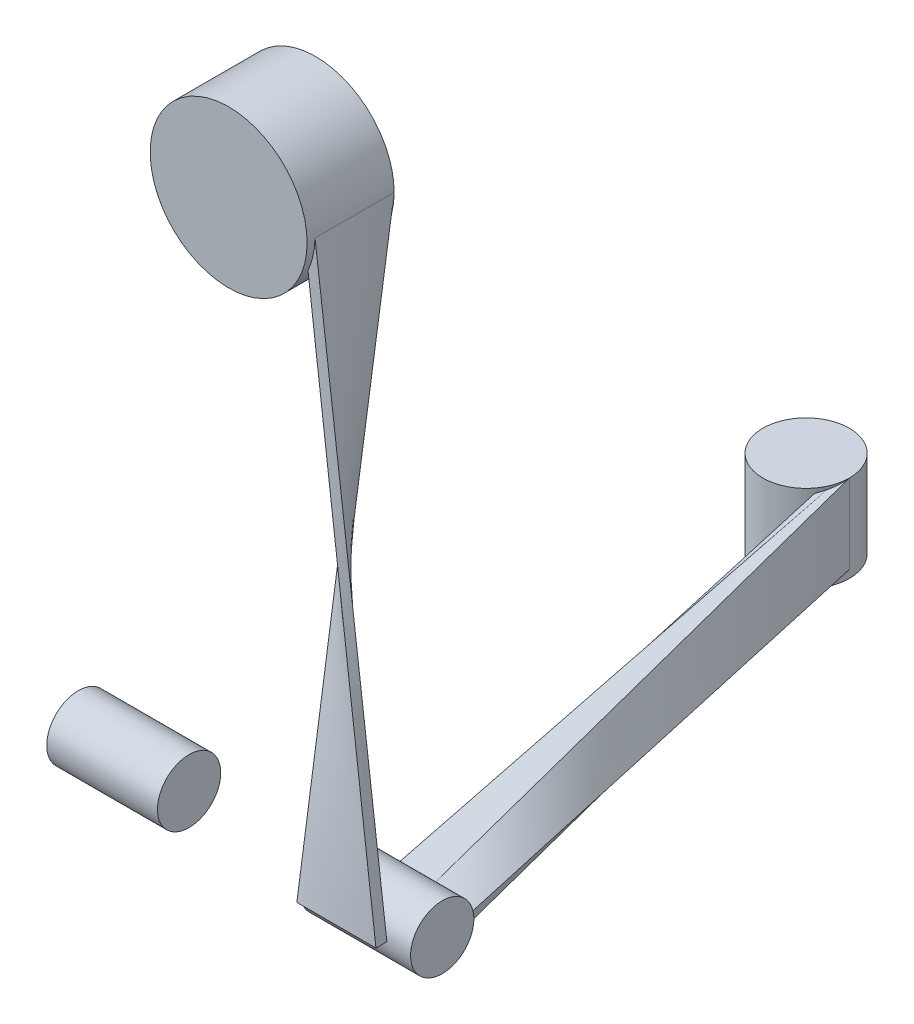
ISO-10303-21;
HEADER;
FILE_DESCRIPTION(('STEP AP214'),'2;1');
FILE_NAME('part.step','',(''),(''),'','','');
FILE_SCHEMA(('AUTOMOTIVE_DESIGN { 1 0 10303 214 1 1 1 1 }'));
ENDSEC;
DATA;
#1=APPLICATION_CONTEXT('core data for automotive mechanical design processes');
#2=APPLICATION_PROTOCOL_DEFINITION('international standard','automotive_design',2000,#1);
#3=PRODUCT_CONTEXT('',#1,'mechanical');
#4=PRODUCT('Part','Part','',(#3));
#5=PRODUCT_RELATED_PRODUCT_CATEGORY('part','',(#4));
#6=PRODUCT_DEFINITION_FORMATION('','',#4);
#7=PRODUCT_DEFINITION_CONTEXT('part definition',#1,'design');
#8=PRODUCT_DEFINITION('design','',#6,#7);
#9=PRODUCT_DEFINITION_SHAPE('','',#8);
#10=(LENGTH_UNIT() NAMED_UNIT(*) SI_UNIT(.MILLI.,.METRE.));
#11=(NAMED_UNIT(*) PLANE_ANGLE_UNIT() SI_UNIT($,.RADIAN.));
#12=(NAMED_UNIT(*) SI_UNIT($,.STERADIAN.) SOLID_ANGLE_UNIT());
#13=UNCERTAINTY_MEASURE_WITH_UNIT(LENGTH_MEASURE(1.E-05),#10,'distance_accuracy_value','');
#14=(GEOMETRIC_REPRESENTATION_CONTEXT(3) GLOBAL_UNCERTAINTY_ASSIGNED_CONTEXT((#13)) GLOBAL_UNIT_ASSIGNED_CONTEXT((#10,
#11,#12)) REPRESENTATION_CONTEXT('',''));
#15=CARTESIAN_POINT('',(0.,0.,0.));
#16=DIRECTION('',(0.,0.,1.));
#17=DIRECTION('',(1.,0.,0.));
#18=AXIS2_PLACEMENT_3D('',#15,#16,#17);
#19=CARTESIAN_POINT('',(-23.,-71.5,6.99999999999999));
#20=DIRECTION('',(1.,0.,0.));
#21=DIRECTION('',(0.,0.,-1.));
#22=AXIS2_PLACEMENT_3D('',#19,#20,#21);
#23=CYLINDRICAL_SURFACE('',#22,4.);
#24=CARTESIAN_POINT('',(-23.,-71.5,6.99999999999999));
#25=DIRECTION('',(1.,0.,0.));
#26=DIRECTION('',(0.,0.,-1.));
#27=AXIS2_PLACEMENT_3D('',#24,#25,#26);
#28=CIRCLE('',#27,4.);
#29=CARTESIAN_POINT('',(-23.,-71.5,2.99999999999999));
#30=VERTEX_POINT('',#29);
#31=EDGE_CURVE('E12',#30,#30,#28,.T.);
#32=ORIENTED_EDGE('',*,*,#31,.T.);
#33=EDGE_LOOP('',(#32));
#34=FACE_BOUND('',#33,.T.);
#35=CARTESIAN_POINT('',(-9.,-71.5,6.99999999999999));
#36=DIRECTION('',(1.,0.,0.));
#37=DIRECTION('',(0.,0.,-1.));
#38=AXIS2_PLACEMENT_3D('',#35,#36,#37);
#39=CIRCLE('',#38,4.);
#40=CARTESIAN_POINT('',(-9.,-71.5,2.99999999999999));
#41=VERTEX_POINT('',#40);
#42=EDGE_CURVE('E83',#41,#41,#39,.T.);
#43=ORIENTED_EDGE('',*,*,#42,.F.);
#44=EDGE_LOOP('',(#43));
#45=FACE_BOUND('',#44,.T.);
#46=ADVANCED_FACE('F80',(#34,#45),#23,.T.);
#47=CARTESIAN_POINT('',(-23.,0.,0.));
#48=DIRECTION('',(1.,0.,0.));
#49=DIRECTION('',(0.,0.,-1.));
#50=AXIS2_PLACEMENT_3D('',#47,#48,#49);
#51=PLANE('',#50);
#52=ORIENTED_EDGE('',*,*,#31,.F.);
#53=EDGE_LOOP('',(#52));
#54=FACE_BOUND('',#53,.T.);
#55=ADVANCED_FACE('F95',(#54),#51,.F.);
#56=CARTESIAN_POINT('',(-9.,0.,0.));
#57=DIRECTION('',(1.,0.,0.));
#58=DIRECTION('',(0.,0.,-1.));
#59=AXIS2_PLACEMENT_3D('',#56,#57,#58);
#60=PLANE('',#59);
#61=ORIENTED_EDGE('',*,*,#42,.T.);
#62=EDGE_LOOP('',(#61));
#63=FACE_BOUND('',#62,.T.);
#64=ADVANCED_FACE('F92',(#63),#60,.T.);
#65=CLOSED_SHELL('',(#46,#55,#64));
#66=MANIFOLD_SOLID_BREP('B2',#65);
#67=CARTESIAN_POINT('',(0.,0.,7.));
#68=DIRECTION('',(0.,0.,-1.));
#69=DIRECTION('',(-1.,0.,0.));
#70=AXIS2_PLACEMENT_3D('',#67,#68,#69);
#71=PLANE('',#70);
#72=DIRECTION('',(1.,0.,0.));
#73=VECTOR('',#72,1.);
#74=CARTESIAN_POINT('',(15.,-75.5,7.));
#75=LINE('',#74,#73);
#76=CARTESIAN_POINT('',(9.99999999999999,-75.5,7.));
#77=VERTEX_POINT('',#76);
#78=CARTESIAN_POINT('',(20.,-75.5,7.00000000000021));
#79=VERTEX_POINT('',#78);
#80=EDGE_CURVE('E460',#77,#79,#75,.T.);
#81=ORIENTED_EDGE('',*,*,#80,.F.);
#82=DIRECTION('',(0.,1.,0.));
#83=VECTOR('',#82,1.);
#84=CARTESIAN_POINT('',(10.,-76.88,7.));
#85=LINE('',#84,#83);
#86=CARTESIAN_POINT('',(10.,-76.88,7.));
#87=VERTEX_POINT('',#86);
#88=EDGE_CURVE('E456',#87,#77,#85,.T.);
#89=ORIENTED_EDGE('',*,*,#88,.F.);
#90=DIRECTION('',(-1.,0.,0.));
#91=VECTOR('',#90,1.);
#92=CARTESIAN_POINT('',(20.,-76.88,7.));
#93=LINE('',#92,#91);
#94=CARTESIAN_POINT('',(20.,-76.88,7.));
#95=VERTEX_POINT('',#94);
#96=EDGE_CURVE('E461',#95,#87,#93,.T.);
#97=ORIENTED_EDGE('',*,*,#96,.F.);
#98=DIRECTION('',(0.,-1.,0.));
#99=VECTOR('',#98,1.);
#100=CARTESIAN_POINT('',(20.,-75.5,7.));
#101=LINE('',#100,#99);
#102=EDGE_CURVE('E133',#79,#95,#101,.T.);
#103=ORIENTED_EDGE('',*,*,#102,.F.);
#104=EDGE_LOOP('',(#81,#89,#97,#103));
#105=FACE_BOUND('',#104,.T.);
#106=ADVANCED_FACE('F128',(#105),#71,.F.);
#107=CARTESIAN_POINT('',(20.,-75.5,7.));
#108=CARTESIAN_POINT('',(5.463458,-74.5,-62.));
#109=CARTESIAN_POINT('',(20.,-75.73,7.));
#110=CARTESIAN_POINT('',(5.233458,-74.5,-62.));
#111=CARTESIAN_POINT('',(20.,-75.96,7.));
#112=CARTESIAN_POINT('',(5.00345800000001,-74.5,-62.));
#113=CARTESIAN_POINT('',(20.,-76.42,7.));
#114=CARTESIAN_POINT('',(4.54345800000001,-74.5,-62.));
#115=CARTESIAN_POINT('',(20.,-76.65,7.));
#116=CARTESIAN_POINT('',(4.313458,-74.5,-62.));
#117=CARTESIAN_POINT('',(20.,-76.88,7.));
#118=CARTESIAN_POINT('',(4.083458,-74.5,-62.));
#119=B_SPLINE_SURFACE_WITH_KNOTS('',3,1,((#107,#108),(#109,#110),(#111,#112),(#113,#114),(#115,
#116),(#117,#118)),.UNSPECIFIED.,.F.,.F.,.F.,(4,2,4),(2,2),(0.,0.5,1.),(0.,1.),.UNSPECIFIED.);
#120=DIRECTION('',(0.20612862013212,-0.0141800312709942,0.978422157698599));
#121=VECTOR('',#120,1.);
#122=CARTESIAN_POINT('',(12.731729,-75.,-27.5));
#123=LINE('',#122,#121);
#124=CARTESIAN_POINT('',(5.463458,-74.5,-62.));
#125=VERTEX_POINT('',#124);
#126=CARTESIAN_POINT('',(19.975579097858,-75.4983200335993,6.88408231835338));
#127=VERTEX_POINT('',#126);
#128=EDGE_CURVE('E464',#125,#127,#123,.T.);
#129=CARTESIAN_POINT('',(19.975579097858,-75.4983200335993,6.88408231835338));
#130=CARTESIAN_POINT('',(19.9765955344266,-75.4984599250472,6.88890755440199));
#131=CARTESIAN_POINT('',(19.9776120502508,-75.4985910827776,6.89373302696626));
#132=CARTESIAN_POINT('',(19.9796453969786,-75.4988359494927,6.90338524075657));
#133=CARTESIAN_POINT('',(19.9806622279062,-75.4989496553856,6.908211982056));
#134=CARTESIAN_POINT('',(19.9826961938223,-75.4991596074379,6.91786673332959));
#135=CARTESIAN_POINT('',(19.983713328832,-75.4992558502939,6.92269474337112));
#136=CARTESIAN_POINT('',(19.9857478918878,-75.4994308655051,6.93235203213304));
#137=CARTESIAN_POINT('',(19.9867653199517,-75.499509634345,6.93718131091338));
#138=CARTESIAN_POINT('',(19.988800458086,-75.4996496906863,6.94684113716113));
#139=CARTESIAN_POINT('',(19.9898181681704,-75.4997109744604,6.95167168467964));
#140=CARTESIAN_POINT('',(19.991853859311,-75.4998160498596,6.96133404841292));
#141=CARTESIAN_POINT('',(19.9928718403766,-75.4998598375448,6.96616586466854));
#142=CARTESIAN_POINT('',(19.9949080624387,-75.4999299098852,6.9758307658857));
#143=CARTESIAN_POINT('',(19.9959263034395,-75.4999561903879,6.98066385087641));
#144=CARTESIAN_POINT('',(19.9979630343297,-75.4999912377036,6.99033128957906));
#145=CARTESIAN_POINT('',(19.9989815242179,-75.5000000001514,6.99516564330707));
#146=CARTESIAN_POINT('',(20.,-75.5,7.));
#147=B_SPLINE_CURVE_WITH_KNOTS('',3,(#129,#130,#131,#132,#133,#134,#135,#136,#137,#138,#139,
#140,#141,#142,#143,#144,#145,#146),.UNSPECIFIED.,.F.,.F.,(4,2,2,2,2,2,2,2,4),(0.,
0.0147993349118109,0.0296012886589448,0.0444060395082219,0.0592137659664348,0.0740246467743555,
0.088838860900777,0.103656587536501,0.118478006088347),.UNSPECIFIED.);
#148=EDGE_CURVE('E598',#127,#79,#147,.T.);
#149=DIRECTION('',(-0.224645038041559,0.033591165124869,-0.973861509922669));
#150=VECTOR('',#149,1.);
#151=CARTESIAN_POINT('',(12.041729,-75.69,-27.5));
#152=LINE('',#151,#150);
#153=CARTESIAN_POINT('',(4.71868734566497,-74.5949858230941,-59.2462093304637));
#154=VERTEX_POINT('',#153);
#155=EDGE_CURVE('E469',#95,#154,#152,.T.);
#156=CARTESIAN_POINT('',(4.71868734566497,-74.5949858230941,-59.2462093304637));
#157=CARTESIAN_POINT('',(4.77671235352827,-74.5881884599952,-59.3456295087412));
#158=CARTESIAN_POINT('',(4.83159559031591,-74.5818252761272,-59.4468989892565));
#159=CARTESIAN_POINT('',(4.9348787283373,-74.5699278675479,-59.6527466711836));
#160=CARTESIAN_POINT('',(4.98327823869854,-74.5643936928112,-59.7573250716047));
#161=CARTESIAN_POINT('',(5.08729794072035,-74.552529015796,-60.0021266471361));
#162=CARTESIAN_POINT('',(5.14053360864297,-74.5464802186046,-60.1433858553577));
#163=CARTESIAN_POINT('',(5.23515990925472,-74.5356015359915,-60.4298843168284));
#164=CARTESIAN_POINT('',(5.27654621207469,-74.5307720962103,-60.575125003759));
#165=CARTESIAN_POINT('',(5.36210815838171,-74.5203383057846,-60.930768606394));
#166=CARTESIAN_POINT('',(5.40005334055956,-74.5152708230695,-61.1427381618645));
#167=CARTESIAN_POINT('',(5.43806382969528,-74.5088140995293,-61.4629326867535));
#168=CARTESIAN_POINT('',(5.4475828064581,-74.5068515512632,-61.5701200230614));
#169=CARTESIAN_POINT('',(5.46027873433381,-74.5032241697694,-61.7848606894537));
#170=CARTESIAN_POINT('',(5.46345651404456,-74.5015592976706,-61.8924139698805));
#171=CARTESIAN_POINT('',(5.463458,-74.5,-62.));
#172=B_SPLINE_CURVE_WITH_KNOTS('',3,(#156,#157,#158,#159,#160,#161,#162,#163,#164,#165,#166,
#167,#168,#169,#170,#171),.UNSPECIFIED.,.F.,.F.,(4,2,2,2,2,2,2,4),(0.,0.345862053528235,
0.691744948033598,1.14442147731344,1.59726320834681,2.24172924708018,2.56445405663763,
2.88713669330579),.UNSPECIFIED.);
#173=EDGE_CURVE('E139',#154,#125,#172,.T.);
#174=ORIENTED_EDGE('',*,*,#128,.T.);
#175=ORIENTED_EDGE('',*,*,#148,.T.);
#176=ORIENTED_EDGE('',*,*,#102,.T.);
#177=ORIENTED_EDGE('',*,*,#155,.T.);
#178=ORIENTED_EDGE('',*,*,#173,.T.);
#179=EDGE_LOOP('',(#174,#175,#176,#177,#178));
#180=FACE_BOUND('',#179,.T.);
#181=ADVANCED_FACE('F425',(#180),#119,.T.);
#182=CARTESIAN_POINT('',(15.,-75.5,7.));
#183=CARTESIAN_POINT('',(5.463458,-64.5,-62.));
#184=CARTESIAN_POINT('',(15.8333333333333,-75.5,7.));
#185=CARTESIAN_POINT('',(5.463458,-66.1666666666667,-62.));
#186=CARTESIAN_POINT('',(16.6666666666666,-75.5,7.));
#187=CARTESIAN_POINT('',(5.463458,-67.8333333333333,-62.));
#188=CARTESIAN_POINT('',(18.3333333333333,-75.5,7.));
#189=CARTESIAN_POINT('',(5.463458,-71.1666666666666,-62.));
#190=CARTESIAN_POINT('',(19.1666666666667,-75.5,7.));
#191=CARTESIAN_POINT('',(5.463458,-72.8333333333333,-62.));
#192=CARTESIAN_POINT('',(20.,-75.5,7.));
#193=CARTESIAN_POINT('',(5.463458,-74.5,-62.));
#194=B_SPLINE_SURFACE_WITH_KNOTS('',3,1,((#182,#183),(#184,#185),(#186,#187),(#188,#189),(#190,
#191),(#192,#193)),.UNSPECIFIED.,.F.,.F.,.F.,(4,2,4),(2,2),(0.,0.5,1.),(0.,1.),.UNSPECIFIED.);
#195=DIRECTION('',(-0.135233432087798,0.155986074718255,-0.978458105050873));
#196=VECTOR('',#195,1.);
#197=CARTESIAN_POINT('',(10.231729,-70.,-27.5));
#198=LINE('',#197,#196);
#199=CARTESIAN_POINT('',(14.8281000213016,-75.3017206063076,5.75624743956567));
#200=VERTEX_POINT('',#199);
#201=CARTESIAN_POINT('',(5.463458,-64.5,-62.));
#202=VERTEX_POINT('',#201);
#203=EDGE_CURVE('E516',#200,#202,#198,.T.);
#204=CARTESIAN_POINT('',(14.8281000213027,-75.3017206063089,5.75624743957397));
#205=CARTESIAN_POINT('',(15.1534396317837,-75.3243377222698,5.82536342218275));
#206=CARTESIAN_POINT('',(15.47876133414,-75.3450805850817,5.89516273990611));
#207=CARTESIAN_POINT('',(16.1293946406331,-75.3827370245946,6.0358193789808));
#208=CARTESIAN_POINT('',(16.4547062448334,-75.3996506350301,6.10667669100568));
#209=CARTESIAN_POINT('',(17.3124153188483,-75.4390893103099,6.29448074494803));
#210=CARTESIAN_POINT('',(17.8448307034792,-75.4583339693529,6.41205724935827));
#211=CARTESIAN_POINT('',(18.6436442207838,-75.4792648576255,6.58892528883653));
#212=CARTESIAN_POINT('',(18.9099986351453,-75.4849194624004,6.6479766451433));
#213=CARTESIAN_POINT('',(19.4427519178339,-75.4935931756057,6.76607447885192));
#214=CARTESIAN_POINT('',(19.7091507862308,-75.4966122798508,6.82512095624586));
#215=CARTESIAN_POINT('',(19.9755790978582,-75.4983200335993,6.88408231835426));
#216=B_SPLINE_CURVE_WITH_KNOTS('',3,(#204,#205,#206,#207,#208,#209,#210,#211,#212,#213,#214,
#215),.UNSPECIFIED.,.F.,.F.,(4,2,2,2,2,4),(0.,1.00009309164087,2.00017737244281,
3.63680571648833,4.45543641478357,5.27406841314321),.UNSPECIFIED.);
#217=EDGE_CURVE('E147',#200,#127,#216,.T.);
#218=DIRECTION('',(0.,1.,0.));
#219=VECTOR('',#218,1.);
#220=CARTESIAN_POINT('',(5.463458,-74.5,-62.));
#221=LINE('',#220,#219);
#222=EDGE_CURVE('E512',#125,#202,#221,.T.);
#223=ORIENTED_EDGE('',*,*,#203,.F.);
#224=ORIENTED_EDGE('',*,*,#217,.T.);
#225=ORIENTED_EDGE('',*,*,#128,.F.);
#226=ORIENTED_EDGE('',*,*,#222,.T.);
#227=EDGE_LOOP('',(#223,#224,#225,#226));
#228=FACE_BOUND('',#227,.T.);
#229=ADVANCED_FACE('F418',(#228),#194,.T.);
#230=CARTESIAN_POINT('',(10.,-76.88,7.));
#231=CARTESIAN_POINT('',(4.083458,-64.5,-62.));
#232=CARTESIAN_POINT('',(10.,-76.6449357977616,7.));
#233=CARTESIAN_POINT('',(4.19845906173077,-64.5,-62.));
#234=CARTESIAN_POINT('',(10.,-76.4098715955233,7.));
#235=CARTESIAN_POINT('',(4.31346012346154,-64.5,-62.));
#236=CARTESIAN_POINT('',(10.,-75.9397431910468,7.));
#237=CARTESIAN_POINT('',(4.54346224692308,-64.5,-62.));
#238=CARTESIAN_POINT('',(10.,-75.7046789888087,7.));
#239=CARTESIAN_POINT('',(4.65846330865384,-64.5,-62.));
#240=CARTESIAN_POINT('',(10.,-75.4696147865707,7.));
#241=CARTESIAN_POINT('',(4.77346437038461,-64.5,-62.));
#242=B_SPLINE_SURFACE_WITH_KNOTS('',3,1,((#230,#231),(#232,#233),(#234,#235),(#236,#237),(#238,
#239),(#240,#241)),.UNSPECIFIED.,.F.,.F.,.F.,(4,2,4),(2,2),(0.,0.5,1.),(0.,1.),.UNSPECIFIED.);
#243=CARTESIAN_POINT('',(9.99999999999999,-75.5,7.));
#244=CARTESIAN_POINT('',(9.99544295478679,-75.5000009258233,6.94000866866954));
#245=CARTESIAN_POINT('',(9.99087371024786,-75.4986504222832,6.88001838194644));
#246=CARTESIAN_POINT('',(9.98175739692386,-75.4932694477038,6.7605140372389));
#247=CARTESIAN_POINT('',(9.97721035680078,-75.4892548730793,6.70099926100899));
#248=CARTESIAN_POINT('',(9.96814856192735,-75.4785894636102,6.58244182463377));
#249=CARTESIAN_POINT('',(9.96363375056592,-75.4719490831002,6.52339822822882));
#250=CARTESIAN_POINT('',(9.95464642809602,-75.456060798609,6.40577997049787));
#251=CARTESIAN_POINT('',(9.95017385070983,-75.4468181076566,6.34720461000855));
#252=CARTESIAN_POINT('',(9.94128080066651,-75.4257372976536,6.23051855676873));
#253=CARTESIAN_POINT('',(9.93686032822147,-75.4138991680417,6.17240786591006));
#254=CARTESIAN_POINT('',(9.92808151314324,-75.3876240140299,6.05664999666609));
#255=CARTESIAN_POINT('',(9.92372331164261,-75.3731818650703,5.99900397069653));
#256=CARTESIAN_POINT('',(9.91507957860443,-75.3416796373374,5.8841795398449));
#257=CARTESIAN_POINT('',(9.91079440285879,-75.3246094256233,5.82700388792477));
#258=CARTESIAN_POINT('',(9.90230758428322,-75.2878177537737,5.71312770318724));
#259=CARTESIAN_POINT('',(9.89810659078673,-75.2680811120004,5.65643202670079));
#260=CARTESIAN_POINT('',(9.893969911527,-75.2470755543221,5.60020544714519));
#261=B_SPLINE_CURVE_WITH_KNOTS('',3,(#243,#244,#245,#246,#247,#248,#249,#250,#251,#252,#253,
#254,#255,#256,#257,#258,#259,#260),.UNSPECIFIED.,.F.,.F.,(4,2,2,2,2,2,2,2,4),(0.,
0.180477114351185,0.359886896905421,0.538589458681093,0.716936554302278,0.895284375665488,
1.07398708397861,1.2533969135936,1.43387504064012),.UNSPECIFIED.);
#262=CARTESIAN_POINT('',(9.893969911527,-75.2470755543221,5.6002054471452));
#263=VERTEX_POINT('',#262);
#264=EDGE_CURVE('E565',#77,#263,#261,.T.);
#265=DIRECTION('',(-0.0745989853875457,0.15657066002449,-0.984845480163586));
#266=VECTOR('',#265,1.);
#267=CARTESIAN_POINT('',(7.38673218519231,-69.9848073932854,-27.5));
#268=LINE('',#267,#266);
#269=CARTESIAN_POINT('',(4.94880919815811,-64.8680191529919,-59.6851218524532));
#270=VERTEX_POINT('',#269);
#271=EDGE_CURVE('E584',#263,#270,#268,.T.);
#272=CARTESIAN_POINT('',(4.94880919815811,-64.8680191529919,-59.6851218524532));
#273=CARTESIAN_POINT('',(4.89976117009596,-64.8887269876538,-59.580246222876));
#274=CARTESIAN_POINT('',(4.84741112273659,-64.9099811354849,-59.4770322432967));
#275=CARTESIAN_POINT('',(4.73638161042354,-64.9536006600867,-59.2743098216643));
#276=CARTESIAN_POINT('',(4.67770216206145,-64.9759660339444,-59.1748013698986));
#277=CARTESIAN_POINT('',(4.53722813123559,-65.0281662550119,-58.9529256624914));
#278=CARTESIAN_POINT('',(4.45352810245022,-65.058356679383,-58.8318446013756));
#279=CARTESIAN_POINT('',(4.3651805300429,-65.0894870554339,-58.7144905634136));
#280=B_SPLINE_CURVE_WITH_KNOTS('',3,(#272,#273,#274,#275,#276,#277,#278,#279),.UNSPECIFIED.,.F.,
.F.,(4,2,2,4),(0.,0.352772434906377,0.705543945094785,1.15584590687369),.UNSPECIFIED.);
#281=CARTESIAN_POINT('',(4.3651805300429,-65.0894870554339,-58.7144905634136));
#282=VERTEX_POINT('',#281);
#283=EDGE_CURVE('E525',#270,#282,#280,.T.);
#284=DIRECTION('',(-0.0841002688557157,0.175974636609317,-0.980795632152089));
#285=VECTOR('',#284,1.);
#286=CARTESIAN_POINT('',(7.041729,-70.69,-27.5));
#287=LINE('',#286,#285);
#288=EDGE_CURVE('E474',#87,#282,#287,.T.);
#289=ORIENTED_EDGE('',*,*,#88,.T.);
#290=ORIENTED_EDGE('',*,*,#264,.T.);
#291=ORIENTED_EDGE('',*,*,#271,.T.);
#292=ORIENTED_EDGE('',*,*,#283,.T.);
#293=ORIENTED_EDGE('',*,*,#288,.F.);
#294=EDGE_LOOP('',(#289,#290,#291,#292,#293));
#295=FACE_BOUND('',#294,.T.);
#296=ADVANCED_FACE('F424',(#295),#242,.T.);
#297=CARTESIAN_POINT('',(10.,-75.4696147865707,7.));
#298=CARTESIAN_POINT('',(4.77346437038461,-64.5,-62.));
#299=CARTESIAN_POINT('',(10.8333333333333,-75.4746789888089,7.));
#300=CARTESIAN_POINT('',(4.88846330865384,-64.5,-62.));
#301=CARTESIAN_POINT('',(11.6666666666667,-75.4797431910471,7.));
#302=CARTESIAN_POINT('',(5.00346224692307,-64.5,-62.));
#303=CARTESIAN_POINT('',(13.3333333333333,-75.4898715955236,7.));
#304=CARTESIAN_POINT('',(5.23346012346153,-64.5,-62.));
#305=CARTESIAN_POINT('',(14.1666666666667,-75.4949357977618,7.));
#306=CARTESIAN_POINT('',(5.34845906173076,-64.5,-62.));
#307=CARTESIAN_POINT('',(15.,-75.5,7.));
#308=CARTESIAN_POINT('',(5.463458,-64.5,-62.));
#309=B_SPLINE_SURFACE_WITH_KNOTS('',3,1,((#297,#298),(#299,#300),(#301,#302),(#303,#304),(#305,
#306),(#307,#308)),.UNSPECIFIED.,.F.,.F.,.F.,(4,2,4),(2,2),(0.,0.5,1.),(0.,1.),.UNSPECIFIED.);
#310=CARTESIAN_POINT('',(9.893969911527,-75.2470755543221,5.6002054471452));
#311=CARTESIAN_POINT('',(10.5603337056963,-75.2540967273385,5.61902428972113));
#312=CARTESIAN_POINT('',(11.2266791615208,-75.2612246607016,5.63851445792299));
#313=CARTESIAN_POINT('',(12.3822169553549,-75.2738518582001,5.67398748472547));
#314=CARTESIAN_POINT('',(12.8714238278382,-75.2792804891844,5.68952577937479));
#315=CARTESIAN_POINT('',(13.849796289443,-75.2903398104302,5.72187449885857));
#316=CARTESIAN_POINT('',(14.3389618782771,-75.2959705019973,5.73868493191406));
#317=CARTESIAN_POINT('',(14.8281000213016,-75.3017206063076,5.75624743956567));
#318=B_SPLINE_CURVE_WITH_KNOTS('',3,(#310,#311,#312,#313,#314,#315,#316,#317),.UNSPECIFIED.,.F.,
.F.,(4,2,2,4),(0.,2.00000151791001,3.46845122981902,4.93691043221012),.UNSPECIFIED.);
#319=EDGE_CURVE('E78',#263,#200,#318,.T.);
#320=CARTESIAN_POINT('',(5.463458,-64.5,-62.));
#321=CARTESIAN_POINT('',(5.46345649389399,-64.5155020892895,-61.902759838164));
#322=CARTESIAN_POINT('',(5.46086097170616,-64.5309976682139,-61.8055443344982));
#323=CARTESIAN_POINT('',(5.45048632444439,-64.5619412095869,-61.6113660864136));
#324=CARTESIAN_POINT('',(5.44270633426037,-64.5773891636562,-61.5144033868904));
#325=CARTESIAN_POINT('',(5.41163497258446,-64.6235464037645,-61.2245969953528));
#326=CARTESIAN_POINT('',(5.38061213586441,-64.6541252013403,-61.0324829975575));
#327=CARTESIAN_POINT('',(5.31799483930566,-64.7000709854885,-60.7435787762064));
#328=CARTESIAN_POINT('',(5.29377481689546,-64.7157164282723,-60.6451567116562));
#329=CARTESIAN_POINT('',(5.23988995865483,-64.7467586479838,-60.4497788018606));
#330=CARTESIAN_POINT('',(5.21022611829005,-64.7621554698155,-60.352822692051));
#331=CARTESIAN_POINT('',(5.14513365274197,-64.7928412111168,-60.1594819544078));
#332=CARTESIAN_POINT('',(5.1096381501175,-64.8081264295409,-60.0631192944334));
#333=CARTESIAN_POINT('',(5.0332469488108,-64.8383477082439,-59.8724772875124));
#334=CARTESIAN_POINT('',(4.99235004077132,-64.8532836894456,-59.7781984126533));
#335=CARTESIAN_POINT('',(4.9488091981581,-64.8680191529919,-59.6851218524532));
#336=B_SPLINE_CURVE_WITH_KNOTS('',3,(#320,#321,#322,#323,#324,#325,#326,#327,#328,#329,#330,
#331,#332,#333,#334,#335),.UNSPECIFIED.,.F.,.F.,(4,2,2,2,2,2,2,4),(0.,0.295319349980537,
0.590687990985558,1.1803610065385,1.4879172416571,1.7954172924674,2.1067276061205,
2.41810773968461),.UNSPECIFIED.);
#337=EDGE_CURVE('E515',#202,#270,#336,.T.);
#338=ORIENTED_EDGE('',*,*,#271,.F.);
#339=ORIENTED_EDGE('',*,*,#319,.T.);
#340=ORIENTED_EDGE('',*,*,#203,.T.);
#341=ORIENTED_EDGE('',*,*,#337,.T.);
#342=EDGE_LOOP('',(#338,#339,#340,#341));
#343=FACE_BOUND('',#342,.T.);
#344=ADVANCED_FACE('F535',(#343),#309,.T.);
#345=CARTESIAN_POINT('',(0.,-75.5,-62.));
#346=DIRECTION('',(0.,1.,0.));
#347=DIRECTION('',(0.,0.,1.));
#348=AXIS2_PLACEMENT_3D('',#345,#346,#347);
#349=CYLINDRICAL_SURFACE('',#348,5.463458);
#350=ORIENTED_EDGE('',*,*,#173,.F.);
#351=CARTESIAN_POINT('',(4.3651805300429,-65.0894870554339,-58.7144905634136));
#352=CARTESIAN_POINT('',(4.40638108126172,-65.9974865429784,-58.7692415922567));
#353=CARTESIAN_POINT('',(4.44524285487731,-66.9056507747247,-58.8230061309175));
#354=CARTESIAN_POINT('',(4.51865428578998,-68.7222823836941,-58.9283107019998));
#355=CARTESIAN_POINT('',(4.5532039442496,-69.6307497608354,-58.979850735021));
#356=CARTESIAN_POINT('',(4.61000952156178,-71.2151482692331,-59.0675658306862));
#357=CARTESIAN_POINT('',(4.63314714006366,-71.8910174522402,-59.10429404278));
#358=CARTESIAN_POINT('',(4.67739690330081,-73.2428979114479,-59.1763298644062));
#359=CARTESIAN_POINT('',(4.6985090479278,-73.9189091876561,-59.2116374738627));
#360=CARTESIAN_POINT('',(4.71868734566522,-74.5949858230942,-59.2462093304633));
#361=B_SPLINE_CURVE_WITH_KNOTS('',3,(#351,#352,#353,#354,#355,#356,#357,#358,#359,#360),
.UNSPECIFIED.,.F.,.F.,(4,2,2,2,4),(0.,2.73173922587284,5.46347771527669,7.49525859214797,
9.52703957764111),.UNSPECIFIED.);
#362=EDGE_CURVE('E631',#282,#154,#361,.T.);
#363=ORIENTED_EDGE('',*,*,#362,.F.);
#364=ORIENTED_EDGE('',*,*,#283,.F.);
#365=ORIENTED_EDGE('',*,*,#337,.F.);
#366=CARTESIAN_POINT('',(0.,-64.5,-62.));
#367=DIRECTION('',(0.,1.,0.));
#368=DIRECTION('',(0.,0.,1.));
#369=AXIS2_PLACEMENT_3D('',#366,#367,#368);
#370=CIRCLE('',#369,5.463458);
#371=EDGE_CURVE('E627',#202,#202,#370,.T.);
#372=ORIENTED_EDGE('',*,*,#371,.F.);
#373=ORIENTED_EDGE('',*,*,#222,.F.);
#374=EDGE_LOOP('',(#350,#363,#364,#365,#372,#373));
#375=FACE_BOUND('',#374,.T.);
#376=CARTESIAN_POINT('',(0.,-75.5,-62.));
#377=DIRECTION('',(0.,1.,0.));
#378=DIRECTION('',(0.,0.,1.));
#379=AXIS2_PLACEMENT_3D('',#376,#377,#378);
#380=CIRCLE('',#379,5.463458);
#381=CARTESIAN_POINT('',(0.,-75.5,-56.536542));
#382=VERTEX_POINT('',#381);
#383=EDGE_CURVE('E628',#382,#382,#380,.T.);
#384=ORIENTED_EDGE('',*,*,#383,.T.);
#385=EDGE_LOOP('',(#384));
#386=FACE_BOUND('',#385,.T.);
#387=ADVANCED_FACE('F130',(#375,#386),#349,.T.);
#388=CARTESIAN_POINT('',(0.,-75.5,0.));
#389=DIRECTION('',(0.,1.,0.));
#390=DIRECTION('',(0.,0.,1.));
#391=AXIS2_PLACEMENT_3D('',#388,#389,#390);
#392=PLANE('',#391);
#393=ORIENTED_EDGE('',*,*,#383,.F.);
#394=EDGE_LOOP('',(#393));
#395=FACE_BOUND('',#394,.T.);
#396=ADVANCED_FACE('F542',(#395),#392,.F.);
#397=CARTESIAN_POINT('',(0.,-64.5,0.));
#398=DIRECTION('',(0.,1.,0.));
#399=DIRECTION('',(0.,0.,1.));
#400=AXIS2_PLACEMENT_3D('',#397,#398,#399);
#401=PLANE('',#400);
#402=ORIENTED_EDGE('',*,*,#371,.T.);
#403=EDGE_LOOP('',(#402));
#404=FACE_BOUND('',#403,.T.);
#405=ADVANCED_FACE('F550',(#404),#401,.T.);
#406=CARTESIAN_POINT('',(20.,-76.88,7.));
#407=CARTESIAN_POINT('',(4.083458,-74.5,-62.));
#408=CARTESIAN_POINT('',(18.3333333333333,-76.88,7.));
#409=CARTESIAN_POINT('',(4.083458,-72.8333333333331,-62.));
#410=CARTESIAN_POINT('',(16.6666666666667,-76.88,7.));
#411=CARTESIAN_POINT('',(4.083458,-71.1666666666664,-62.));
#412=CARTESIAN_POINT('',(13.3333333333333,-76.88,7.));
#413=CARTESIAN_POINT('',(4.083458,-67.833333333333,-62.));
#414=CARTESIAN_POINT('',(11.6666666666667,-76.88,7.));
#415=CARTESIAN_POINT('',(4.083458,-66.1666666666665,-62.));
#416=CARTESIAN_POINT('',(10.,-76.88,7.));
#417=CARTESIAN_POINT('',(4.083458,-64.5,-62.));
#418=B_SPLINE_SURFACE_WITH_KNOTS('',3,1,((#406,#407),(#408,#409),(#410,#411),(#412,#413),(#414,
#415),(#416,#417)),.UNSPECIFIED.,.F.,.F.,.F.,(4,2,4),(2,2),(0.,0.5,1.),(0.,1.),.UNSPECIFIED.);
#419=ORIENTED_EDGE('',*,*,#288,.T.);
#420=ORIENTED_EDGE('',*,*,#362,.T.);
#421=ORIENTED_EDGE('',*,*,#155,.F.);
#422=ORIENTED_EDGE('',*,*,#96,.T.);
#423=EDGE_LOOP('',(#419,#420,#421,#422));
#424=FACE_BOUND('',#423,.T.);
#425=ADVANCED_FACE('F376',(#424),#418,.T.);
#426=CARTESIAN_POINT('',(23.,-71.5,6.99999999999999));
#427=DIRECTION('',(-1.,0.,0.));
#428=DIRECTION('',(0.,0.,1.));
#429=AXIS2_PLACEMENT_3D('',#426,#427,#428);
#430=CYLINDRICAL_SURFACE('',#429,4.);
#431=CARTESIAN_POINT('',(9.,-71.5,6.99999999999999));
#432=DIRECTION('',(1.,0.,0.));
#433=DIRECTION('',(0.,0.,-1.));
#434=AXIS2_PLACEMENT_3D('',#431,#432,#433);
#435=CIRCLE('',#434,4.);
#436=CARTESIAN_POINT('',(9.,-71.5,2.99999999999999));
#437=VERTEX_POINT('',#436);
#438=EDGE_CURVE('E358',#437,#437,#435,.T.);
#439=ORIENTED_EDGE('',*,*,#438,.T.);
#440=EDGE_LOOP('',(#439));
#441=FACE_BOUND('',#440,.T.);
#442=CARTESIAN_POINT('',(23.,-71.5,6.99999999999999));
#443=DIRECTION('',(1.,0.,0.));
#444=DIRECTION('',(0.,0.,-1.));
#445=AXIS2_PLACEMENT_3D('',#442,#443,#444);
#446=CIRCLE('',#445,4.);
#447=CARTESIAN_POINT('',(23.,-71.5,2.99999999999999));
#448=VERTEX_POINT('',#447);
#449=EDGE_CURVE('E349',#448,#448,#446,.T.);
#450=ORIENTED_EDGE('',*,*,#449,.F.);
#451=EDGE_LOOP('',(#450));
#452=FACE_BOUND('',#451,.T.);
#453=DIRECTION('',(-1.,0.,0.));
#454=VECTOR('',#453,1.);
#455=CARTESIAN_POINT('',(20.,-71.5,11.));
#456=LINE('',#455,#454);
#457=CARTESIAN_POINT('',(20.,-71.5,11.));
#458=VERTEX_POINT('',#457);
#459=CARTESIAN_POINT('',(9.99999999999999,-71.5,11.));
#460=VERTEX_POINT('',#459);
#461=EDGE_CURVE('E786',#458,#460,#456,.T.);
#462=ORIENTED_EDGE('',*,*,#461,.T.);
#463=CARTESIAN_POINT('',(9.99999999999999,-71.5,11.));
#464=CARTESIAN_POINT('',(9.99994267118096,-71.4488579275333,11.0000005148254));
#465=CARTESIAN_POINT('',(9.99986837968371,-71.3977159330193,10.9990192011832));
#466=CARTESIAN_POINT('',(9.99969904944998,-71.2957292724243,10.9951051546736));
#467=CARTESIAN_POINT('',(9.99960410226498,-71.2448842799773,10.9921809194487));
#468=CARTESIAN_POINT('',(9.99940620520494,-71.1434900764627,10.9844044459933));
#469=CARTESIAN_POINT('',(9.99930327929926,-71.0929404352402,10.97955781516));
#470=CARTESIAN_POINT('',(9.99910204160344,-70.9921357932602,10.9679521406707));
#471=CARTESIAN_POINT('',(9.99900372330916,-70.9418804705254,10.961195893629));
#472=CARTESIAN_POINT('',(9.99882420911119,-70.8416629256036,10.9457778214468));
#473=CARTESIAN_POINT('',(9.99874301321847,-70.7917007036044,10.9371159950852));
#474=CARTESIAN_POINT('',(9.99861024828611,-70.6920689834245,10.9178853189636));
#475=CARTESIAN_POINT('',(9.99855872263238,-70.6424000184978,10.9073137060833));
#476=CARTESIAN_POINT('',(9.99849791602369,-70.5433569428807,10.8842536726184));
#477=CARTESIAN_POINT('',(9.99848875818198,-70.4939841073176,10.8717597747719));
#478=CARTESIAN_POINT('',(9.99852538425433,-70.3955369380775,10.8448378330597));
#479=CARTESIAN_POINT('',(9.99857140815852,-70.346464848005,10.8304015848655));
#480=CARTESIAN_POINT('',(9.99865132527587,-70.2976878612717,10.8150289017341));
#481=B_SPLINE_CURVE_WITH_KNOTS('',3,(#463,#464,#465,#466,#467,#468,#469,#470,#471,#472,#473,
#474,#475,#476,#477,#478,#479,#480),.UNSPECIFIED.,.F.,.F.,(4,2,2,2,2,2,2,2,4),(0.,
0.153416789691838,0.306166967794716,0.458474830434553,0.610560785260742,0.762646837550007,
0.914954719650774,1.06770490423928,1.22112182916013),.UNSPECIFIED.);
#482=CARTESIAN_POINT('',(9.99865132527588,-70.2976878612717,10.8150289017341));
#483=VERTEX_POINT('',#482);
#484=EDGE_CURVE('E367',#460,#483,#481,.T.);
#485=ORIENTED_EDGE('',*,*,#484,.T.);
#486=CARTESIAN_POINT('',(9.99865132527588,-70.2976878612717,10.8150289017341));
#487=CARTESIAN_POINT('',(10.6612553713985,-70.3679337891523,10.8371735574081));
#488=CARTESIAN_POINT('',(11.3238481394305,-70.4388807011498,10.8573929525796));
#489=CARTESIAN_POINT('',(12.6490250973155,-70.5818417207656,10.893894699773));
#490=CARTESIAN_POINT('',(13.3116092871876,-70.6538558253644,10.9101770629326));
#491=CARTESIAN_POINT('',(14.9757832773585,-70.8356484844485,10.9460195572011));
#492=CARTESIAN_POINT('',(15.9773789556912,-70.9458978813652,10.9629946130627));
#493=CARTESIAN_POINT('',(17.4798541900302,-71.1116576601937,10.9814928515155));
#494=CARTESIAN_POINT('',(17.9807146889781,-71.1669776165337,10.9864982730484));
#495=CARTESIAN_POINT('',(18.9824553939991,-71.2776024912443,10.9941977331526));
#496=CARTESIAN_POINT('',(19.4833356000828,-71.3329074096068,10.996891770477));
#497=CARTESIAN_POINT('',(19.9842288892583,-71.3881337701071,10.9984354373441));
#498=B_SPLINE_CURVE_WITH_KNOTS('',3,(#486,#487,#488,#489,#490,#491,#492,#493,#494,#495,#496,
#497),.UNSPECIFIED.,.F.,.F.,(4,2,2,2,2,4),(0.,2.00004956596934,4.00009347383262,7.0234082924579,
8.53519730649794,10.0469871361551),.UNSPECIFIED.);
#499=CARTESIAN_POINT('',(19.9842288892583,-71.3881337701071,10.9984354373441));
#500=VERTEX_POINT('',#499);
#501=EDGE_CURVE('E357',#483,#500,#498,.T.);
#502=ORIENTED_EDGE('',*,*,#501,.T.);
#503=CARTESIAN_POINT('',(20.,-71.5,11.));
#504=CARTESIAN_POINT('',(19.9993423062272,-71.4953349054367,11.0000000001364));
#505=CARTESIAN_POINT('',(19.998684599928,-71.4906698126338,10.9999918404232));
#506=CARTESIAN_POINT('',(19.9973693321195,-71.4813407672701,10.9999592037228));
#507=CARTESIAN_POINT('',(19.9967117706119,-71.4766768146959,10.9999347305207));
#508=CARTESIAN_POINT('',(19.9953968019713,-71.4673500497992,10.9998694764562));
#509=CARTESIAN_POINT('',(19.9947393948361,-71.4626872374517,10.9998286991875));
#510=CARTESIAN_POINT('',(19.9934247445231,-71.4533627530205,10.9997308468036));
#511=CARTESIAN_POINT('',(19.9927675013396,-71.4487010809017,10.9996737750907));
#512=CARTESIAN_POINT('',(19.9914531885068,-71.4393788769374,10.9995433435687));
#513=CARTESIAN_POINT('',(19.9907961188487,-71.4347183450482,10.9994699869708));
#514=CARTESIAN_POINT('',(19.9894821626386,-71.4253984215512,10.9993069954534));
#515=CARTESIAN_POINT('',(19.9888252760753,-71.4207390298922,10.9992173635542));
#516=CARTESIAN_POINT('',(19.9875116956215,-71.4114213868647,10.9990218311458));
#517=CARTESIAN_POINT('',(19.9868550017174,-71.4067631354388,10.9989159334662));
#518=CARTESIAN_POINT('',(19.9855418161436,-71.3974477728762,10.9986878794071));
#519=CARTESIAN_POINT('',(19.9848853244582,-71.3927906616772,10.9985657256666));
#520=CARTESIAN_POINT('',(19.9842288892583,-71.3881337701071,10.9984354373441));
#521=B_SPLINE_CURVE_WITH_KNOTS('',3,(#503,#504,#505,#506,#507,#508,#509,#510,#511,#512,#513,
#514,#515,#516,#517,#518,#519,#520),.UNSPECIFIED.,.F.,.F.,(4,2,2,2,2,2,2,2,4),(0.,
0.0141336766590848,0.028264075052644,0.0423913605421408,0.0565156983046542,0.0706372533275146,
0.0847561904028038,0.0988726741221541,0.112986868871141),.UNSPECIFIED.);
#522=EDGE_CURVE('E800',#500,#458,#521,.F.);
#523=ORIENTED_EDGE('',*,*,#522,.T.);
#524=EDGE_LOOP('',(#462,#485,#502,#523));
#525=FACE_BOUND('',#524,.T.);
#526=ORIENTED_EDGE('',*,*,#264,.F.);
#527=ORIENTED_EDGE('',*,*,#80,.T.);
#528=ORIENTED_EDGE('',*,*,#148,.F.);
#529=ORIENTED_EDGE('',*,*,#217,.F.);
#530=ORIENTED_EDGE('',*,*,#319,.F.);
#531=EDGE_LOOP('',(#526,#527,#528,#529,#530));
#532=FACE_BOUND('',#531,.T.);
#533=ADVANCED_FACE('F370',(#441,#452,#525,#532),#430,.T.);
#534=CARTESIAN_POINT('',(23.,-71.5,6.99999999999999));
#535=DIRECTION('',(1.,0.,0.));
#536=DIRECTION('',(0.,0.,-1.));
#537=AXIS2_PLACEMENT_3D('',#534,#535,#536);
#538=PLANE('',#537);
#539=ORIENTED_EDGE('',*,*,#449,.T.);
#540=EDGE_LOOP('',(#539));
#541=FACE_BOUND('',#540,.T.);
#542=ADVANCED_FACE('F375',(#541),#538,.T.);
#543=CARTESIAN_POINT('',(9.,-71.5,6.99999999999999));
#544=DIRECTION('',(1.,0.,0.));
#545=DIRECTION('',(0.,0.,-1.));
#546=AXIS2_PLACEMENT_3D('',#543,#544,#545);
#547=PLANE('',#546);
#548=ORIENTED_EDGE('',*,*,#438,.F.);
#549=EDGE_LOOP('',(#548));
#550=FACE_BOUND('',#549,.T.);
#551=ADVANCED_FACE('F378',(#550),#547,.F.);
#552=CARTESIAN_POINT('',(8.539796,0.,0.));
#553=CARTESIAN_POINT('',(9.99999999999999,-71.5,12.38));
#554=CARTESIAN_POINT('',(9.919796,0.,0.));
#555=CARTESIAN_POINT('',(9.99999999999999,-71.5,11.));
#556=B_SPLINE_SURFACE_WITH_KNOTS('',1,1,((#552,#553),(#554,#555)),.UNSPECIFIED.,.F.,.F.,.F.,(2,
2),(2,2),(0.,1.),(0.,1.),.UNSPECIFIED.);
#557=DIRECTION('',(0.,0.,1.));
#558=VECTOR('',#557,1.);
#559=CARTESIAN_POINT('',(9.99999999999999,-71.5,11.));
#560=LINE('',#559,#558);
#561=CARTESIAN_POINT('',(9.99999999999999,-71.5,12.38));
#562=VERTEX_POINT('',#561);
#563=EDGE_CURVE('E304',#460,#562,#560,.T.);
#564=DIRECTION('',(0.0201189456989481,-0.985139485629949,0.170573801847535));
#565=VECTOR('',#564,1.);
#566=CARTESIAN_POINT('',(9.269898,-35.75,6.19));
#567=LINE('',#566,#565);
#568=CARTESIAN_POINT('',(8.539796,0.,0.));
#569=VERTEX_POINT('',#568);
#570=EDGE_CURVE('E250',#569,#562,#567,.T.);
#571=DIRECTION('',(1.,0.,0.));
#572=VECTOR('',#571,1.);
#573=CARTESIAN_POINT('',(8.539796,0.,0.));
#574=LINE('',#573,#572);
#575=CARTESIAN_POINT('',(9.919796,0.,0.));
#576=VERTEX_POINT('',#575);
#577=EDGE_CURVE('E224',#569,#576,#574,.T.);
#578=DIRECTION('',(0.00110868971913919,-0.988371090200697,0.152057090800107));
#579=VECTOR('',#578,1.);
#580=CARTESIAN_POINT('',(9.959898,-35.75,5.5));
#581=LINE('',#580,#579);
#582=EDGE_CURVE('E253',#576,#483,#581,.T.);
#583=ORIENTED_EDGE('',*,*,#484,.F.);
#584=ORIENTED_EDGE('',*,*,#563,.T.);
#585=ORIENTED_EDGE('',*,*,#570,.F.);
#586=ORIENTED_EDGE('',*,*,#577,.T.);
#587=ORIENTED_EDGE('',*,*,#582,.T.);
#588=EDGE_LOOP('',(#583,#584,#585,#586,#587));
#589=FACE_BOUND('',#588,.T.);
#590=ADVANCED_FACE('F279',(#589),#556,.T.);
#591=CARTESIAN_POINT('',(9.919796,0.,10.));
#592=CARTESIAN_POINT('',(20.,-71.5,11.));
#593=CARTESIAN_POINT('',(8.539796,0.,10.));
#594=CARTESIAN_POINT('',(20.,-71.5,12.38));
#595=B_SPLINE_SURFACE_WITH_KNOTS('',1,1,((#591,#592),(#593,#594)),.UNSPECIFIED.,.F.,.F.,.F.,(2,
2),(2,2),(0.,1.),(0.,1.),.UNSPECIFIED.);
#596=DIRECTION('',(0.139587964111006,-0.990112842352888,0.0138477320608794));
#597=VECTOR('',#596,1.);
#598=CARTESIAN_POINT('',(14.959898,-35.75,10.5));
#599=LINE('',#598,#597);
#600=CARTESIAN_POINT('',(9.919796,0.,10.));
#601=VERTEX_POINT('',#600);
#602=EDGE_CURVE('E242',#601,#500,#599,.T.);
#603=DIRECTION('',(-1.,0.,0.));
#604=VECTOR('',#603,1.);
#605=CARTESIAN_POINT('',(9.919796,0.,10.));
#606=LINE('',#605,#604);
#607=CARTESIAN_POINT('',(8.539796,0.,10.));
#608=VERTEX_POINT('',#607);
#609=EDGE_CURVE('E221',#601,#608,#606,.T.);
#610=DIRECTION('',(-0.158177130258611,0.986864179162143,-0.0328494649846979));
#611=VECTOR('',#610,1.);
#612=CARTESIAN_POINT('',(14.269898,-35.75,11.19));
#613=LINE('',#612,#611);
#614=CARTESIAN_POINT('',(20.,-71.5,12.38));
#615=VERTEX_POINT('',#614);
#616=EDGE_CURVE('E240',#615,#608,#613,.T.);
#617=DIRECTION('',(0.,0.,-1.));
#618=VECTOR('',#617,1.);
#619=CARTESIAN_POINT('',(20.,-71.5,12.38));
#620=LINE('',#619,#618);
#621=EDGE_CURVE('E314',#615,#458,#620,.T.);
#622=ORIENTED_EDGE('',*,*,#522,.F.);
#623=ORIENTED_EDGE('',*,*,#602,.F.);
#624=ORIENTED_EDGE('',*,*,#609,.T.);
#625=ORIENTED_EDGE('',*,*,#616,.F.);
#626=ORIENTED_EDGE('',*,*,#621,.T.);
#627=EDGE_LOOP('',(#622,#623,#624,#625,#626));
#628=FACE_BOUND('',#627,.T.);
#629=ADVANCED_FACE('F238',(#628),#595,.T.);
#630=CARTESIAN_POINT('',(9.919796,0.,0.));
#631=CARTESIAN_POINT('',(9.99999999999999,-71.5,11.));
#632=CARTESIAN_POINT('',(9.919796,0.,0.416666666666667));
#633=CARTESIAN_POINT('',(10.4166666666667,-71.5,11.));
#634=CARTESIAN_POINT('',(9.91979599999999,0.,1.25));
#635=CARTESIAN_POINT('',(11.25,-71.5000000000001,11.));
#636=CARTESIAN_POINT('',(9.91979600000001,0.,2.5));
#637=CARTESIAN_POINT('',(12.5,-71.4999999999999,11.));
#638=CARTESIAN_POINT('',(9.919796,0.,3.75));
#639=CARTESIAN_POINT('',(13.75,-71.5,11.));
#640=CARTESIAN_POINT('',(9.919796,0.,4.58333333333333));
#641=CARTESIAN_POINT('',(14.5833333333333,-71.5,11.));
#642=CARTESIAN_POINT('',(9.919796,0.,5.41666666666667));
#643=CARTESIAN_POINT('',(15.4166666666667,-71.5,11.));
#644=CARTESIAN_POINT('',(9.919796,0.,6.25000000000001));
#645=CARTESIAN_POINT('',(16.25,-71.5,11.));
#646=CARTESIAN_POINT('',(9.91979599999999,0.,7.49999999999999));
#647=CARTESIAN_POINT('',(17.5,-71.5,11.));
#648=CARTESIAN_POINT('',(9.91979600000001,0.,8.75000000000001));
#649=CARTESIAN_POINT('',(18.75,-71.5,11.));
#650=CARTESIAN_POINT('',(9.919796,0.,9.58333333333333));
#651=CARTESIAN_POINT('',(19.5833333333333,-71.5,11.));
#652=CARTESIAN_POINT('',(9.919796,0.,10.));
#653=CARTESIAN_POINT('',(20.,-71.5,11.));
#654=B_SPLINE_SURFACE_WITH_KNOTS('',3,1,((#630,#631),(#632,#633),(#634,#635),(#636,#637),(#638,
#639),(#640,#641),(#642,#643),(#644,#645),(#646,#647),(#648,#649),(#650,#651),(#652,#653)),
.UNSPECIFIED.,.F.,.F.,.F.,(4,1,1,1,2,1,1,1,4),(2,2),(0.,0.125,0.25,0.375,0.5,0.625,0.75,0.875,
1.),(0.,1.),.UNSPECIFIED.);
#655=DIRECTION('',(0.,0.,1.));
#656=VECTOR('',#655,1.);
#657=CARTESIAN_POINT('',(9.919796,0.,0.));
#658=LINE('',#657,#656);
#659=CARTESIAN_POINT('',(9.919796,0.,5.));
#660=VERTEX_POINT('',#659);
#661=EDGE_CURVE('E251',#576,#660,#658,.T.);
#662=EDGE_CURVE('E255',#660,#601,#658,.T.);
#663=ORIENTED_EDGE('',*,*,#501,.F.);
#664=ORIENTED_EDGE('',*,*,#582,.F.);
#665=ORIENTED_EDGE('',*,*,#661,.T.);
#666=ORIENTED_EDGE('',*,*,#662,.T.);
#667=ORIENTED_EDGE('',*,*,#602,.T.);
#668=EDGE_LOOP('',(#663,#664,#665,#666,#667));
#669=FACE_BOUND('',#668,.T.);
#670=ADVANCED_FACE('F331',(#669),#654,.T.);
#671=CARTESIAN_POINT('',(0.,-71.5,0.));
#672=DIRECTION('',(0.,1.,0.));
#673=DIRECTION('',(0.,0.,1.));
#674=AXIS2_PLACEMENT_3D('',#671,#672,#673);
#675=PLANE('',#674);
#676=ORIENTED_EDGE('',*,*,#621,.F.);
#677=DIRECTION('',(1.,0.,0.));
#678=VECTOR('',#677,1.);
#679=CARTESIAN_POINT('',(9.99999999999999,-71.5,12.38));
#680=LINE('',#679,#678);
#681=EDGE_CURVE('E247',#562,#615,#680,.T.);
#682=ORIENTED_EDGE('',*,*,#681,.F.);
#683=ORIENTED_EDGE('',*,*,#563,.F.);
#684=ORIENTED_EDGE('',*,*,#461,.F.);
#685=EDGE_LOOP('',(#676,#682,#683,#684));
#686=FACE_BOUND('',#685,.T.);
#687=ADVANCED_FACE('F736',(#686),#675,.F.);
#688=CARTESIAN_POINT('',(0.,0.,0.));
#689=DIRECTION('',(0.,-1.,0.));
#690=DIRECTION('',(0.,0.,-1.));
#691=AXIS2_PLACEMENT_3D('',#688,#689,#690);
#692=PLANE('',#691);
#693=ORIENTED_EDGE('',*,*,#661,.F.);
#694=ORIENTED_EDGE('',*,*,#577,.F.);
#695=DIRECTION('',(0.,0.,-1.));
#696=VECTOR('',#695,1.);
#697=CARTESIAN_POINT('',(8.539796,0.,10.));
#698=LINE('',#697,#696);
#699=EDGE_CURVE('E216',#608,#569,#698,.T.);
#700=ORIENTED_EDGE('',*,*,#699,.F.);
#701=ORIENTED_EDGE('',*,*,#609,.F.);
#702=ORIENTED_EDGE('',*,*,#662,.F.);
#703=EDGE_LOOP('',(#693,#694,#700,#701,#702));
#704=FACE_BOUND('',#703,.T.);
#705=ADVANCED_FACE('F219',(#704),#692,.F.);
#706=CARTESIAN_POINT('',(8.539796,0.,10.));
#707=CARTESIAN_POINT('',(20.,-71.5,12.38));
#708=CARTESIAN_POINT('',(8.539796,0.,0.));
#709=CARTESIAN_POINT('',(9.99999999999999,-71.5,12.38));
#710=B_SPLINE_SURFACE_WITH_KNOTS('',1,1,((#706,#707),(#708,#709)),.UNSPECIFIED.,.F.,.F.,.F.,(2,
2),(2,2),(0.,1.),(0.,1.),.UNSPECIFIED.);
#711=ORIENTED_EDGE('',*,*,#699,.T.);
#712=ORIENTED_EDGE('',*,*,#570,.T.);
#713=ORIENTED_EDGE('',*,*,#681,.T.);
#714=ORIENTED_EDGE('',*,*,#616,.T.);
#715=EDGE_LOOP('',(#711,#712,#713,#714));
#716=FACE_BOUND('',#715,.T.);
#717=ADVANCED_FACE('F246',(#716),#710,.T.);
#718=CLOSED_SHELL('',(#106,#181,#229,#296,#344,#387,#396,#405,#425,#533,#542,#551,#590,#629,
#670,#687,#705,#717));
#719=MANIFOLD_SOLID_BREP('B7',#718);
#720=CARTESIAN_POINT('',(0.,0.,11.));
#721=DIRECTION('',(0.,0.,-1.));
#722=DIRECTION('',(-1.,0.,0.));
#723=AXIS2_PLACEMENT_3D('',#720,#721,#722);
#724=CYLINDRICAL_SURFACE('',#723,9.919796);
#725=CARTESIAN_POINT('',(0.,0.,11.));
#726=DIRECTION('',(0.,0.,1.));
#727=DIRECTION('',(1.,0.,0.));
#728=AXIS2_PLACEMENT_3D('',#725,#726,#727);
#729=CIRCLE('',#728,9.919796);
#730=CARTESIAN_POINT('',(9.919796,0.,11.));
#731=VERTEX_POINT('',#730);
#732=EDGE_CURVE('E127',#731,#731,#729,.T.);
#733=ORIENTED_EDGE('',*,*,#732,.F.);
#734=EDGE_LOOP('',(#733));
#735=FACE_BOUND('',#734,.T.);
#736=CARTESIAN_POINT('',(0.,0.,0.));
#737=DIRECTION('',(0.,0.,1.));
#738=DIRECTION('',(1.,0.,0.));
#739=AXIS2_PLACEMENT_3D('',#736,#737,#738);
#740=CIRCLE('',#739,9.919796);
#741=CARTESIAN_POINT('',(9.919796,0.,0.));
#742=VERTEX_POINT('',#741);
#743=EDGE_CURVE('E958',#742,#742,#740,.T.);
#744=ORIENTED_EDGE('',*,*,#743,.T.);
#745=EDGE_LOOP('',(#744));
#746=FACE_BOUND('',#745,.T.);
#747=ADVANCED_FACE('F955',(#735,#746),#724,.T.);
#748=CARTESIAN_POINT('',(0.,0.,11.));
#749=DIRECTION('',(0.,0.,1.));
#750=DIRECTION('',(1.,0.,0.));
#751=AXIS2_PLACEMENT_3D('',#748,#749,#750);
#752=PLANE('',#751);
#753=ORIENTED_EDGE('',*,*,#732,.T.);
#754=EDGE_LOOP('',(#753));
#755=FACE_BOUND('',#754,.T.);
#756=ADVANCED_FACE('F970',(#755),#752,.T.);
#757=CARTESIAN_POINT('',(0.,0.,0.));
#758=DIRECTION('',(0.,0.,1.));
#759=DIRECTION('',(1.,0.,0.));
#760=AXIS2_PLACEMENT_3D('',#757,#758,#759);
#761=PLANE('',#760);
#762=ORIENTED_EDGE('',*,*,#743,.F.);
#763=EDGE_LOOP('',(#762));
#764=FACE_BOUND('',#763,.T.);
#765=ADVANCED_FACE('F968',(#764),#761,.F.);
#766=CLOSED_SHELL('',(#747,#756,#765));
#767=MANIFOLD_SOLID_BREP('B72',#766);
#768=ADVANCED_BREP_SHAPE_REPRESENTATION('',(#18,#66,#719,#767),#14);
#769=SHAPE_DEFINITION_REPRESENTATION(#9,#768);
ENDSEC;
END-ISO-10303-21;
